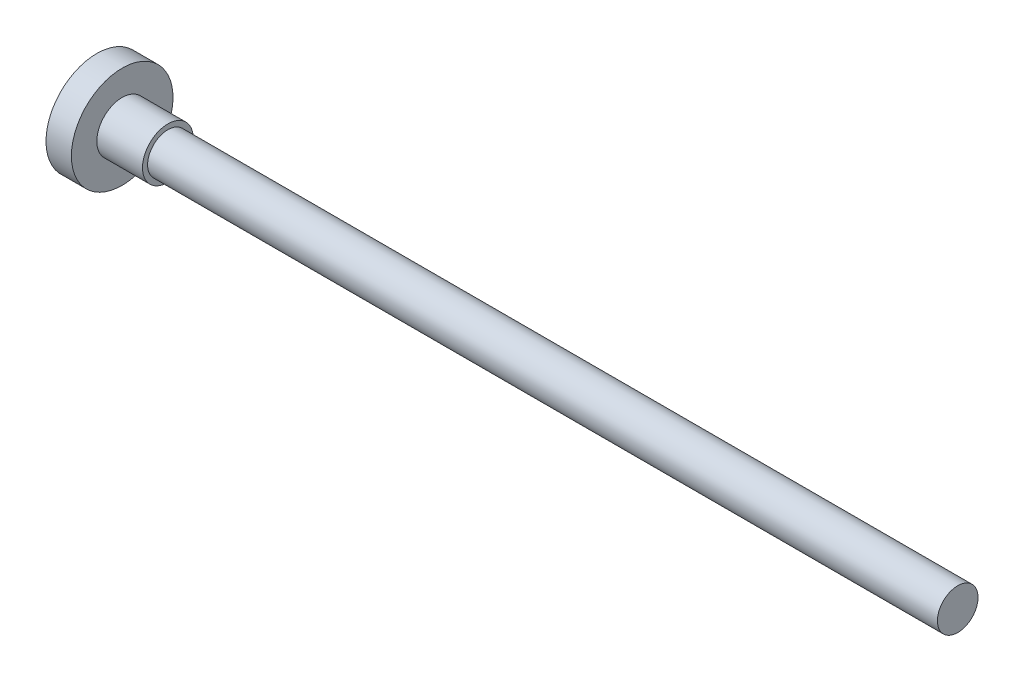
ISO-10303-21;
HEADER;
FILE_DESCRIPTION(('STEP AP214'),'2;1');
FILE_NAME('part.step','',(''),(''),'','','');
FILE_SCHEMA(('AUTOMOTIVE_DESIGN { 1 0 10303 214 1 1 1 1 }'));
ENDSEC;
DATA;
#1=APPLICATION_CONTEXT('core data for automotive mechanical design processes');
#2=APPLICATION_PROTOCOL_DEFINITION('international standard','automotive_design',2000,#1);
#3=PRODUCT_CONTEXT('',#1,'mechanical');
#4=PRODUCT('Part','Part','',(#3));
#5=PRODUCT_RELATED_PRODUCT_CATEGORY('part','',(#4));
#6=PRODUCT_DEFINITION_FORMATION('','',#4);
#7=PRODUCT_DEFINITION_CONTEXT('part definition',#1,'design');
#8=PRODUCT_DEFINITION('design','',#6,#7);
#9=PRODUCT_DEFINITION_SHAPE('','',#8);
#10=(LENGTH_UNIT() NAMED_UNIT(*) SI_UNIT(.MILLI.,.METRE.));
#11=(NAMED_UNIT(*) PLANE_ANGLE_UNIT() SI_UNIT($,.RADIAN.));
#12=(NAMED_UNIT(*) SI_UNIT($,.STERADIAN.) SOLID_ANGLE_UNIT());
#13=UNCERTAINTY_MEASURE_WITH_UNIT(LENGTH_MEASURE(1.E-05),#10,'distance_accuracy_value','');
#14=(GEOMETRIC_REPRESENTATION_CONTEXT(3) GLOBAL_UNCERTAINTY_ASSIGNED_CONTEXT((#13)) GLOBAL_UNIT_ASSIGNED_CONTEXT((#10,
#11,#12)) REPRESENTATION_CONTEXT('',''));
#15=CARTESIAN_POINT('',(0.,0.,0.));
#16=DIRECTION('',(0.,0.,1.));
#17=DIRECTION('',(1.,0.,0.));
#18=AXIS2_PLACEMENT_3D('',#15,#16,#17);
#19=CARTESIAN_POINT('',(0.,0.,0.));
#20=DIRECTION('',(1.,0.,0.));
#21=DIRECTION('',(0.,0.,-1.));
#22=AXIS2_PLACEMENT_3D('',#19,#20,#21);
#23=PLANE('',#22);
#24=CARTESIAN_POINT('',(0.,0.,0.));
#25=DIRECTION('',(-1.,0.,0.));
#26=DIRECTION('',(0.,0.,1.));
#27=AXIS2_PLACEMENT_3D('',#24,#25,#26);
#28=CIRCLE('',#27,10.);
#29=CARTESIAN_POINT('',(0.,0.,10.));
#30=VERTEX_POINT('',#29);
#31=EDGE_CURVE('E10',#30,#30,#28,.T.);
#32=ORIENTED_EDGE('',*,*,#31,.T.);
#33=EDGE_LOOP('',(#32));
#34=FACE_BOUND('',#33,.T.);
#35=ADVANCED_FACE('F33',(#34),#23,.F.);
#36=CARTESIAN_POINT('',(-88.4158484359128,0.,0.));
#37=DIRECTION('',(-1.,0.,0.));
#38=DIRECTION('',(0.,0.,1.));
#39=AXIS2_PLACEMENT_3D('',#36,#37,#38);
#40=CYLINDRICAL_SURFACE('',#39,10.);
#41=ORIENTED_EDGE('',*,*,#31,.F.);
#42=EDGE_LOOP('',(#41));
#43=FACE_BOUND('',#42,.T.);
#44=CARTESIAN_POINT('',(5.,0.,0.));
#45=DIRECTION('',(-1.,0.,0.));
#46=DIRECTION('',(0.,0.,1.));
#47=AXIS2_PLACEMENT_3D('',#44,#45,#46);
#48=CIRCLE('',#47,10.);
#49=CARTESIAN_POINT('',(5.,0.,10.));
#50=VERTEX_POINT('',#49);
#51=EDGE_CURVE('E39',#50,#50,#48,.T.);
#52=ORIENTED_EDGE('',*,*,#51,.T.);
#53=EDGE_LOOP('',(#52));
#54=FACE_BOUND('',#53,.T.);
#55=ADVANCED_FACE('F71',(#43,#54),#40,.T.);
#56=CARTESIAN_POINT('',(5.00000000000001,0.,-10.));
#57=DIRECTION('',(-1.,0.,0.));
#58=DIRECTION('',(0.,0.,1.));
#59=AXIS2_PLACEMENT_3D('',#56,#57,#58);
#60=PLANE('',#59);
#61=ORIENTED_EDGE('',*,*,#51,.F.);
#62=EDGE_LOOP('',(#61));
#63=FACE_BOUND('',#62,.T.);
#64=CARTESIAN_POINT('',(5.,0.,0.));
#65=DIRECTION('',(-1.,0.,0.));
#66=DIRECTION('',(0.,0.,1.));
#67=AXIS2_PLACEMENT_3D('',#64,#65,#66);
#68=CIRCLE('',#67,5.);
#69=CARTESIAN_POINT('',(5.,0.,5.));
#70=VERTEX_POINT('',#69);
#71=EDGE_CURVE('E43',#70,#70,#68,.T.);
#72=ORIENTED_EDGE('',*,*,#71,.T.);
#73=EDGE_LOOP('',(#72));
#74=FACE_BOUND('',#73,.T.);
#75=ADVANCED_FACE('F75',(#63,#74),#60,.F.);
#76=CARTESIAN_POINT('',(-88.4158484359128,0.,0.));
#77=DIRECTION('',(-1.,0.,0.));
#78=DIRECTION('',(0.,0.,1.));
#79=AXIS2_PLACEMENT_3D('',#76,#77,#78);
#80=CYLINDRICAL_SURFACE('',#79,5.);
#81=ORIENTED_EDGE('',*,*,#71,.F.);
#82=EDGE_LOOP('',(#81));
#83=FACE_BOUND('',#82,.T.);
#84=CARTESIAN_POINT('',(14.,0.,0.));
#85=DIRECTION('',(-1.,0.,0.));
#86=DIRECTION('',(0.,0.,1.));
#87=AXIS2_PLACEMENT_3D('',#84,#85,#86);
#88=CIRCLE('',#87,5.);
#89=CARTESIAN_POINT('',(14.,0.,5.));
#90=VERTEX_POINT('',#89);
#91=EDGE_CURVE('E47',#90,#90,#88,.T.);
#92=ORIENTED_EDGE('',*,*,#91,.T.);
#93=EDGE_LOOP('',(#92));
#94=FACE_BOUND('',#93,.T.);
#95=ADVANCED_FACE('F80',(#83,#94),#80,.T.);
#96=CARTESIAN_POINT('',(14.,0.,-5.));
#97=DIRECTION('',(-1.,0.,0.));
#98=DIRECTION('',(0.,0.,1.));
#99=AXIS2_PLACEMENT_3D('',#96,#97,#98);
#100=PLANE('',#99);
#101=ORIENTED_EDGE('',*,*,#91,.F.);
#102=EDGE_LOOP('',(#101));
#103=FACE_BOUND('',#102,.T.);
#104=CARTESIAN_POINT('',(14.,0.,0.));
#105=DIRECTION('',(-1.,0.,0.));
#106=DIRECTION('',(0.,0.,1.));
#107=AXIS2_PLACEMENT_3D('',#104,#105,#106);
#108=CIRCLE('',#107,4.);
#109=CARTESIAN_POINT('',(14.,0.,4.));
#110=VERTEX_POINT('',#109);
#111=EDGE_CURVE('E52',#110,#110,#108,.T.);
#112=ORIENTED_EDGE('',*,*,#111,.T.);
#113=EDGE_LOOP('',(#112));
#114=FACE_BOUND('',#113,.T.);
#115=ADVANCED_FACE('F67',(#103,#114),#100,.F.);
#116=CARTESIAN_POINT('',(-88.4158484359128,0.,0.));
#117=DIRECTION('',(-1.,0.,0.));
#118=DIRECTION('',(0.,0.,1.));
#119=AXIS2_PLACEMENT_3D('',#116,#117,#118);
#120=CYLINDRICAL_SURFACE('',#119,4.);
#121=ORIENTED_EDGE('',*,*,#111,.F.);
#122=EDGE_LOOP('',(#121));
#123=FACE_BOUND('',#122,.T.);
#124=CARTESIAN_POINT('',(169.5,0.,0.));
#125=DIRECTION('',(-1.,0.,0.));
#126=DIRECTION('',(0.,0.,1.));
#127=AXIS2_PLACEMENT_3D('',#124,#125,#126);
#128=CIRCLE('',#127,4.);
#129=CARTESIAN_POINT('',(169.5,0.,4.));
#130=VERTEX_POINT('',#129);
#131=EDGE_CURVE('E55',#130,#130,#128,.T.);
#132=ORIENTED_EDGE('',*,*,#131,.T.);
#133=EDGE_LOOP('',(#132));
#134=FACE_BOUND('',#133,.T.);
#135=ADVANCED_FACE('F59',(#123,#134),#120,.T.);
#136=CARTESIAN_POINT('',(169.5,0.,-4.));
#137=DIRECTION('',(-1.,0.,0.));
#138=DIRECTION('',(0.,0.,1.));
#139=AXIS2_PLACEMENT_3D('',#136,#137,#138);
#140=PLANE('',#139);
#141=ORIENTED_EDGE('',*,*,#131,.F.);
#142=EDGE_LOOP('',(#141));
#143=FACE_BOUND('',#142,.T.);
#144=ADVANCED_FACE('F61',(#143),#140,.F.);
#145=CLOSED_SHELL('',(#35,#55,#75,#95,#115,#135,#144));
#146=MANIFOLD_SOLID_BREP('B2',#145);
#147=ADVANCED_BREP_SHAPE_REPRESENTATION('',(#18,#146),#14);
#148=SHAPE_DEFINITION_REPRESENTATION(#9,#147);
ENDSEC;
END-ISO-10303-21;
